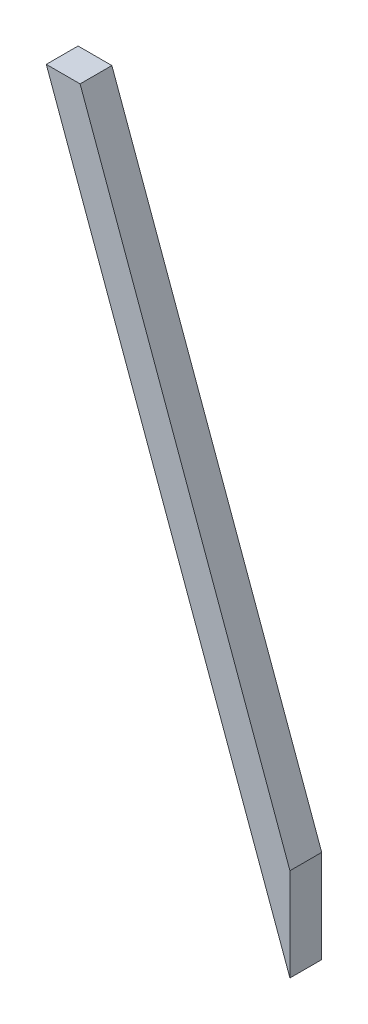
ISO-10303-21;
HEADER;
FILE_DESCRIPTION(('STEP AP214'),'2;1');
FILE_NAME('part.step','',(''),(''),'','','');
FILE_SCHEMA(('AUTOMOTIVE_DESIGN { 1 0 10303 214 1 1 1 1 }'));
ENDSEC;
DATA;
#1=APPLICATION_CONTEXT('core data for automotive mechanical design processes');
#2=APPLICATION_PROTOCOL_DEFINITION('international standard','automotive_design',2000,#1);
#3=PRODUCT_CONTEXT('',#1,'mechanical');
#4=PRODUCT('Part','Part','',(#3));
#5=PRODUCT_RELATED_PRODUCT_CATEGORY('part','',(#4));
#6=PRODUCT_DEFINITION_FORMATION('','',#4);
#7=PRODUCT_DEFINITION_CONTEXT('part definition',#1,'design');
#8=PRODUCT_DEFINITION('design','',#6,#7);
#9=PRODUCT_DEFINITION_SHAPE('','',#8);
#10=(LENGTH_UNIT() NAMED_UNIT(*) SI_UNIT(.MILLI.,.METRE.));
#11=(NAMED_UNIT(*) PLANE_ANGLE_UNIT() SI_UNIT($,.RADIAN.));
#12=(NAMED_UNIT(*) SI_UNIT($,.STERADIAN.) SOLID_ANGLE_UNIT());
#13=UNCERTAINTY_MEASURE_WITH_UNIT(LENGTH_MEASURE(1.E-05),#10,'distance_accuracy_value','');
#14=(GEOMETRIC_REPRESENTATION_CONTEXT(3) GLOBAL_UNCERTAINTY_ASSIGNED_CONTEXT((#13)) GLOBAL_UNIT_ASSIGNED_CONTEXT((#10,
#11,#12)) REPRESENTATION_CONTEXT('',''));
#15=CARTESIAN_POINT('',(0.,0.,0.));
#16=DIRECTION('',(0.,0.,1.));
#17=DIRECTION('',(1.,0.,0.));
#18=AXIS2_PLACEMENT_3D('',#15,#16,#17);
#19=CARTESIAN_POINT('',(-1.79911057696264,-32.2018415443845,6.));
#20=DIRECTION('',(-1.,0.,0.));
#21=DIRECTION('',(0.,-1.,0.));
#22=AXIS2_PLACEMENT_3D('',#19,#20,#21);
#23=PLANE('',#22);
#24=DIRECTION('',(0.,1.,0.));
#25=VECTOR('',#24,1.);
#26=CARTESIAN_POINT('',(-1.79911057696264,-32.2018415443845,0.));
#27=LINE('',#26,#25);
#28=CARTESIAN_POINT('',(-1.79911057696263,-49.7446679453633,0.));
#29=VERTEX_POINT('',#28);
#30=CARTESIAN_POINT('',(-1.79911057696264,-32.2018415443845,0.));
#31=VERTEX_POINT('',#30);
#32=EDGE_CURVE('E113',#29,#31,#27,.T.);
#33=ORIENTED_EDGE('',*,*,#32,.T.);
#34=DIRECTION('',(0.,0.,-1.));
#35=VECTOR('',#34,1.);
#36=CARTESIAN_POINT('',(-1.79911057696264,-32.2018415443845,6.));
#37=LINE('',#36,#35);
#38=CARTESIAN_POINT('',(-1.79911057696264,-32.2018415443845,6.));
#39=VERTEX_POINT('',#38);
#40=EDGE_CURVE('E11',#39,#31,#37,.T.);
#41=ORIENTED_EDGE('',*,*,#40,.F.);
#42=DIRECTION('',(0.,1.,0.));
#43=VECTOR('',#42,1.);
#44=CARTESIAN_POINT('',(-1.79911057696264,-32.2018415443845,6.));
#45=LINE('',#44,#43);
#46=CARTESIAN_POINT('',(-1.79911057696263,-49.7446679453633,6.));
#47=VERTEX_POINT('',#46);
#48=EDGE_CURVE('E97',#47,#39,#45,.T.);
#49=ORIENTED_EDGE('',*,*,#48,.F.);
#50=DIRECTION('',(0.,0.,-1.));
#51=VECTOR('',#50,1.);
#52=CARTESIAN_POINT('',(-1.79911057696263,-49.7446679453633,6.));
#53=LINE('',#52,#51);
#54=EDGE_CURVE('E109',#47,#29,#53,.T.);
#55=ORIENTED_EDGE('',*,*,#54,.T.);
#56=EDGE_LOOP('',(#33,#41,#49,#55));
#57=FACE_BOUND('',#56,.T.);
#58=ADVANCED_FACE('F45',(#57),#23,.F.);
#59=CARTESIAN_POINT('',(-41.4225936222754,76.6627834027574,6.));
#60=DIRECTION('',(-0.93969262078591,-0.342020143325663,0.));
#61=DIRECTION('',(0.342020143325664,-0.93969262078591,0.));
#62=AXIS2_PLACEMENT_3D('',#59,#60,#61);
#63=PLANE('',#62);
#64=DIRECTION('',(-0.342020143325663,0.93969262078591,0.));
#65=VECTOR('',#64,1.);
#66=CARTESIAN_POINT('',(-41.4225936222754,76.6627834027574,0.));
#67=LINE('',#66,#65);
#68=CARTESIAN_POINT('',(-41.4225936222754,76.6627834027574,0.));
#69=VERTEX_POINT('',#68);
#70=EDGE_CURVE('E102',#31,#69,#67,.T.);
#71=ORIENTED_EDGE('',*,*,#70,.T.);
#72=DIRECTION('',(0.,0.,-1.));
#73=VECTOR('',#72,1.);
#74=CARTESIAN_POINT('',(-41.4225936222754,76.6627834027574,6.));
#75=LINE('',#74,#73);
#76=CARTESIAN_POINT('',(-41.4225936222754,76.6627834027574,6.));
#77=VERTEX_POINT('',#76);
#78=EDGE_CURVE('E54',#77,#69,#75,.T.);
#79=ORIENTED_EDGE('',*,*,#78,.F.);
#80=DIRECTION('',(-0.342020143325663,0.93969262078591,0.));
#81=VECTOR('',#80,1.);
#82=CARTESIAN_POINT('',(-41.4225936222754,76.6627834027574,6.));
#83=LINE('',#82,#81);
#84=EDGE_CURVE('E92',#39,#77,#83,.T.);
#85=ORIENTED_EDGE('',*,*,#84,.F.);
#86=ORIENTED_EDGE('',*,*,#40,.T.);
#87=EDGE_LOOP('',(#71,#79,#85,#86));
#88=FACE_BOUND('',#87,.T.);
#89=ADVANCED_FACE('F101',(#88),#63,.F.);
#90=CARTESIAN_POINT('',(-47.8076602571309,76.6627834027574,6.));
#91=DIRECTION('',(0.,-1.,0.));
#92=DIRECTION('',(0.,0.,-1.));
#93=AXIS2_PLACEMENT_3D('',#90,#91,#92);
#94=PLANE('',#93);
#95=DIRECTION('',(-1.,0.,0.));
#96=VECTOR('',#95,1.);
#97=CARTESIAN_POINT('',(-47.8076602571309,76.6627834027574,0.));
#98=LINE('',#97,#96);
#99=CARTESIAN_POINT('',(-47.8076602571309,76.6627834027574,0.));
#100=VERTEX_POINT('',#99);
#101=EDGE_CURVE('E79',#69,#100,#98,.T.);
#102=ORIENTED_EDGE('',*,*,#101,.T.);
#103=DIRECTION('',(0.,0.,-1.));
#104=VECTOR('',#103,1.);
#105=CARTESIAN_POINT('',(-47.8076602571309,76.6627834027574,6.));
#106=LINE('',#105,#104);
#107=CARTESIAN_POINT('',(-47.8076602571309,76.6627834027574,6.));
#108=VERTEX_POINT('',#107);
#109=EDGE_CURVE('E104',#108,#100,#106,.T.);
#110=ORIENTED_EDGE('',*,*,#109,.F.);
#111=DIRECTION('',(-1.,0.,0.));
#112=VECTOR('',#111,1.);
#113=CARTESIAN_POINT('',(-47.8076602571309,76.6627834027574,6.));
#114=LINE('',#113,#112);
#115=EDGE_CURVE('E95',#77,#108,#114,.T.);
#116=ORIENTED_EDGE('',*,*,#115,.F.);
#117=ORIENTED_EDGE('',*,*,#78,.T.);
#118=EDGE_LOOP('',(#102,#110,#116,#117));
#119=FACE_BOUND('',#118,.T.);
#120=ADVANCED_FACE('F105',(#119),#94,.F.);
#121=CARTESIAN_POINT('',(-1.79911057696263,-49.7446679453633,6.));
#122=DIRECTION('',(0.93969262078591,0.342020143325663,0.));
#123=DIRECTION('',(-0.342020143325663,0.939692620785911,0.));
#124=AXIS2_PLACEMENT_3D('',#121,#122,#123);
#125=PLANE('',#124);
#126=DIRECTION('',(0.342020143325663,-0.93969262078591,0.));
#127=VECTOR('',#126,1.);
#128=CARTESIAN_POINT('',(-1.79911057696263,-49.7446679453633,0.));
#129=LINE('',#128,#127);
#130=EDGE_CURVE('E85',#100,#29,#129,.T.);
#131=ORIENTED_EDGE('',*,*,#130,.T.);
#132=ORIENTED_EDGE('',*,*,#54,.F.);
#133=DIRECTION('',(0.342020143325663,-0.93969262078591,0.));
#134=VECTOR('',#133,1.);
#135=CARTESIAN_POINT('',(-1.79911057696263,-49.7446679453633,6.));
#136=LINE('',#135,#134);
#137=EDGE_CURVE('E62',#108,#47,#136,.T.);
#138=ORIENTED_EDGE('',*,*,#137,.F.);
#139=ORIENTED_EDGE('',*,*,#109,.T.);
#140=EDGE_LOOP('',(#131,#132,#138,#139));
#141=FACE_BOUND('',#140,.T.);
#142=ADVANCED_FACE('F126',(#141),#125,.F.);
#143=CARTESIAN_POINT('',(0.,0.,6.));
#144=DIRECTION('',(0.,0.,1.));
#145=DIRECTION('',(1.,0.,0.));
#146=AXIS2_PLACEMENT_3D('',#143,#144,#145);
#147=PLANE('',#146);
#148=ORIENTED_EDGE('',*,*,#48,.T.);
#149=ORIENTED_EDGE('',*,*,#84,.T.);
#150=ORIENTED_EDGE('',*,*,#115,.T.);
#151=ORIENTED_EDGE('',*,*,#137,.T.);
#152=EDGE_LOOP('',(#148,#149,#150,#151));
#153=FACE_BOUND('',#152,.T.);
#154=ADVANCED_FACE('F93',(#153),#147,.T.);
#155=CARTESIAN_POINT('',(0.,0.,0.));
#156=DIRECTION('',(0.,0.,1.));
#157=DIRECTION('',(1.,0.,0.));
#158=AXIS2_PLACEMENT_3D('',#155,#156,#157);
#159=PLANE('',#158);
#160=ORIENTED_EDGE('',*,*,#32,.F.);
#161=ORIENTED_EDGE('',*,*,#130,.F.);
#162=ORIENTED_EDGE('',*,*,#101,.F.);
#163=ORIENTED_EDGE('',*,*,#70,.F.);
#164=EDGE_LOOP('',(#160,#161,#162,#163));
#165=FACE_BOUND('',#164,.T.);
#166=ADVANCED_FACE('F129',(#165),#159,.F.);
#167=CLOSED_SHELL('',(#58,#89,#120,#142,#154,#166));
#168=MANIFOLD_SOLID_BREP('B2',#167);
#169=ADVANCED_BREP_SHAPE_REPRESENTATION('',(#18,#168),#14);
#170=SHAPE_DEFINITION_REPRESENTATION(#9,#169);
ENDSEC;
END-ISO-10303-21;
